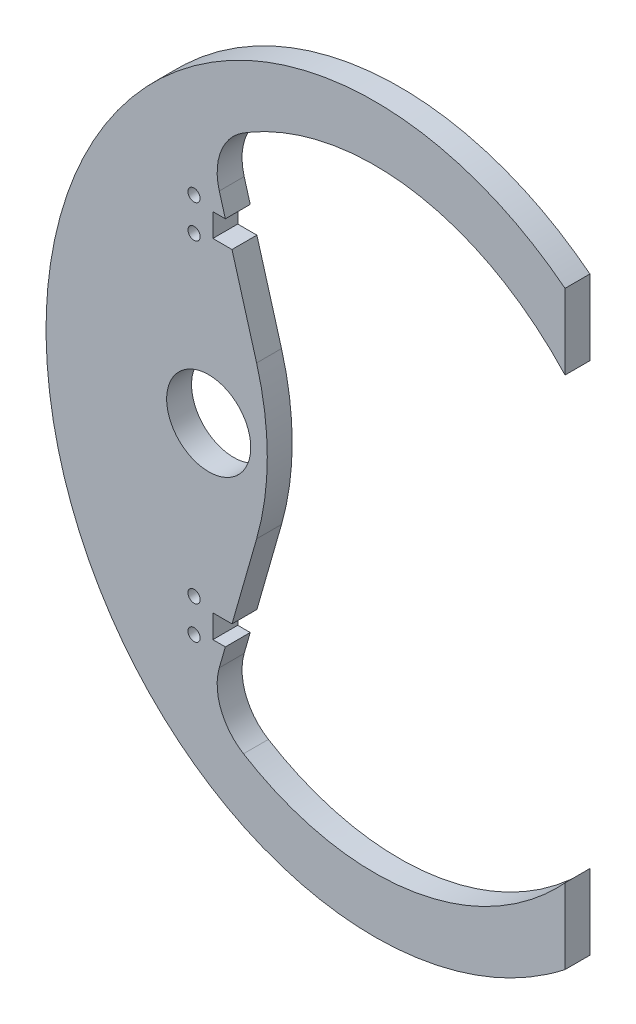
ISO-10303-21;
HEADER;
FILE_DESCRIPTION(('STEP AP214'),'2;1');
FILE_NAME('part.step','',(''),(''),'','','');
FILE_SCHEMA(('AUTOMOTIVE_DESIGN { 1 0 10303 214 1 1 1 1 }'));
ENDSEC;
DATA;
#1=APPLICATION_CONTEXT('core data for automotive mechanical design processes');
#2=APPLICATION_PROTOCOL_DEFINITION('international standard','automotive_design',2000,#1);
#3=PRODUCT_CONTEXT('',#1,'mechanical');
#4=PRODUCT('Part','Part','',(#3));
#5=PRODUCT_RELATED_PRODUCT_CATEGORY('part','',(#4));
#6=PRODUCT_DEFINITION_FORMATION('','',#4);
#7=PRODUCT_DEFINITION_CONTEXT('part definition',#1,'design');
#8=PRODUCT_DEFINITION('design','',#6,#7);
#9=PRODUCT_DEFINITION_SHAPE('','',#8);
#10=(LENGTH_UNIT() NAMED_UNIT(*) SI_UNIT(.MILLI.,.METRE.));
#11=(NAMED_UNIT(*) PLANE_ANGLE_UNIT() SI_UNIT($,.RADIAN.));
#12=(NAMED_UNIT(*) SI_UNIT($,.STERADIAN.) SOLID_ANGLE_UNIT());
#13=UNCERTAINTY_MEASURE_WITH_UNIT(LENGTH_MEASURE(1.E-05),#10,'distance_accuracy_value','');
#14=(GEOMETRIC_REPRESENTATION_CONTEXT(3) GLOBAL_UNCERTAINTY_ASSIGNED_CONTEXT((#13)) GLOBAL_UNIT_ASSIGNED_CONTEXT((#10,
#11,#12)) REPRESENTATION_CONTEXT('',''));
#15=CARTESIAN_POINT('',(0.,0.,0.));
#16=DIRECTION('',(0.,0.,1.));
#17=DIRECTION('',(1.,0.,0.));
#18=AXIS2_PLACEMENT_3D('',#15,#16,#17);
#19=CARTESIAN_POINT('',(0.,0.,2.25));
#20=DIRECTION('',(0.,0.,1.));
#21=DIRECTION('',(1.,0.,0.));
#22=AXIS2_PLACEMENT_3D('',#19,#20,#21);
#23=PLANE('',#22);
#24=CARTESIAN_POINT('',(9.40914805039206,0.,2.25));
#25=DIRECTION('',(0.,0.,1.));
#26=DIRECTION('',(1.,0.,0.));
#27=AXIS2_PLACEMENT_3D('',#24,#25,#26);
#28=CIRCLE('',#27,7.60000000000003);
#29=CARTESIAN_POINT('',(17.0091480503921,0.,2.25));
#30=VERTEX_POINT('',#29);
#31=EDGE_CURVE('E299',#30,#30,#28,.T.);
#32=ORIENTED_EDGE('',*,*,#31,.F.);
#33=EDGE_LOOP('',(#32));
#34=FACE_BOUND('',#33,.T.);
#35=CARTESIAN_POINT('',(6.75917229098305,34.4,2.25));
#36=DIRECTION('',(0.,0.,1.));
#37=DIRECTION('',(1.,0.,0.));
#38=AXIS2_PLACEMENT_3D('',#35,#36,#37);
#39=CIRCLE('',#38,1.1);
#40=CARTESIAN_POINT('',(7.85917229098305,34.4,2.25));
#41=VERTEX_POINT('',#40);
#42=EDGE_CURVE('E197',#41,#41,#39,.T.);
#43=ORIENTED_EDGE('',*,*,#42,.F.);
#44=EDGE_LOOP('',(#43));
#45=FACE_BOUND('',#44,.T.);
#46=CARTESIAN_POINT('',(6.75917229098305,28.4000000000001,2.25));
#47=DIRECTION('',(0.,0.,1.));
#48=DIRECTION('',(1.,0.,0.));
#49=AXIS2_PLACEMENT_3D('',#46,#47,#48);
#50=CIRCLE('',#49,1.1);
#51=CARTESIAN_POINT('',(7.85917229098305,28.4000000000001,2.25));
#52=VERTEX_POINT('',#51);
#53=EDGE_CURVE('E242',#52,#52,#50,.T.);
#54=ORIENTED_EDGE('',*,*,#53,.F.);
#55=EDGE_LOOP('',(#54));
#56=FACE_BOUND('',#55,.T.);
#57=CARTESIAN_POINT('',(6.75917229098305,-34.4,2.25));
#58=DIRECTION('',(0.,0.,-1.));
#59=DIRECTION('',(1.,0.,0.));
#60=AXIS2_PLACEMENT_3D('',#57,#58,#59);
#61=CIRCLE('',#60,1.1);
#62=CARTESIAN_POINT('',(7.85917229098305,-34.4,2.25));
#63=VERTEX_POINT('',#62);
#64=EDGE_CURVE('E208',#63,#63,#61,.T.);
#65=ORIENTED_EDGE('',*,*,#64,.T.);
#66=EDGE_LOOP('',(#65));
#67=FACE_BOUND('',#66,.T.);
#68=CARTESIAN_POINT('',(6.75917229098305,-28.4000000000001,2.25));
#69=DIRECTION('',(0.,0.,-1.));
#70=DIRECTION('',(1.,0.,0.));
#71=AXIS2_PLACEMENT_3D('',#68,#69,#70);
#72=CIRCLE('',#71,1.1);
#73=CARTESIAN_POINT('',(7.85917229098305,-28.4000000000001,2.25));
#74=VERTEX_POINT('',#73);
#75=EDGE_CURVE('E202',#74,#74,#72,.T.);
#76=ORIENTED_EDGE('',*,*,#75,.T.);
#77=EDGE_LOOP('',(#76));
#78=FACE_BOUND('',#77,.T.);
#79=DIRECTION('',(1.,0.,0.));
#80=VECTOR('',#79,1.);
#81=CARTESIAN_POINT('',(0.,-33.5,2.25));
#82=LINE('',#81,#80);
#83=CARTESIAN_POINT('',(10.159172290983,-33.5,2.25));
#84=VERTEX_POINT('',#83);
#85=CARTESIAN_POINT('',(12.4151049743728,-33.5,2.25));
#86=VERTEX_POINT('',#85);
#87=EDGE_CURVE('E184',#84,#86,#82,.T.);
#88=ORIENTED_EDGE('',*,*,#87,.F.);
#89=DIRECTION('',(0.,1.,0.));
#90=VECTOR('',#89,1.);
#91=CARTESIAN_POINT('',(10.159172290983,0.,2.25));
#92=LINE('',#91,#90);
#93=CARTESIAN_POINT('',(10.159172290983,-29.3,2.25));
#94=VERTEX_POINT('',#93);
#95=EDGE_CURVE('E187',#84,#94,#92,.T.);
#96=ORIENTED_EDGE('',*,*,#95,.T.);
#97=DIRECTION('',(-1.,0.,0.));
#98=VECTOR('',#97,1.);
#99=CARTESIAN_POINT('',(1.33673194385019E-13,-29.3000000000001,2.25));
#100=LINE('',#99,#98);
#101=CARTESIAN_POINT('',(13.6179402256946,-29.3,2.25));
#102=VERTEX_POINT('',#101);
#103=EDGE_CURVE('E176',#102,#94,#100,.T.);
#104=ORIENTED_EDGE('',*,*,#103,.F.);
#105=DIRECTION('',(0.275321065869488,0.961352334312706,0.));
#106=VECTOR('',#105,1.);
#107=CARTESIAN_POINT('',(20.3408174478652,-5.82539339690342,2.25));
#108=LINE('',#107,#106);
#109=CARTESIAN_POINT('',(18.0666970568287,-13.7660532934746,2.25));
#110=VERTEX_POINT('',#109);
#111=EDGE_CURVE('E293',#102,#110,#108,.T.);
#112=ORIENTED_EDGE('',*,*,#111,.T.);
#113=CARTESIAN_POINT('',(-30.0009196588065,0.,2.25));
#114=DIRECTION('',(0.,0.,1.));
#115=DIRECTION('',(1.,0.,0.));
#116=AXIS2_PLACEMENT_3D('',#113,#114,#115);
#117=CIRCLE('',#116,50.);
#118=CARTESIAN_POINT('',(18.0666970568287,13.7660532934746,2.25));
#119=VERTEX_POINT('',#118);
#120=EDGE_CURVE('E292',#110,#119,#117,.T.);
#121=ORIENTED_EDGE('',*,*,#120,.T.);
#122=DIRECTION('',(0.275321065869487,-0.961352334312706,0.));
#123=VECTOR('',#122,1.);
#124=CARTESIAN_POINT('',(20.3408174478652,5.82539339690341,2.25));
#125=LINE('',#124,#123);
#126=CARTESIAN_POINT('',(13.6179402256946,29.3,2.25));
#127=VERTEX_POINT('',#126);
#128=EDGE_CURVE('E296',#127,#119,#125,.T.);
#129=ORIENTED_EDGE('',*,*,#128,.F.);
#130=DIRECTION('',(-1.,0.,0.));
#131=VECTOR('',#130,1.);
#132=CARTESIAN_POINT('',(1.33673194385019E-13,29.3000000000001,2.25));
#133=LINE('',#132,#131);
#134=CARTESIAN_POINT('',(10.159172290983,29.3,2.25));
#135=VERTEX_POINT('',#134);
#136=EDGE_CURVE('E215',#127,#135,#133,.T.);
#137=ORIENTED_EDGE('',*,*,#136,.T.);
#138=DIRECTION('',(0.,-1.,0.));
#139=VECTOR('',#138,1.);
#140=CARTESIAN_POINT('',(10.159172290983,0.,2.25));
#141=LINE('',#140,#139);
#142=CARTESIAN_POINT('',(10.159172290983,33.5,2.25));
#143=VERTEX_POINT('',#142);
#144=EDGE_CURVE('E224',#143,#135,#141,.T.);
#145=ORIENTED_EDGE('',*,*,#144,.F.);
#146=DIRECTION('',(1.,0.,0.));
#147=VECTOR('',#146,1.);
#148=CARTESIAN_POINT('',(0.,33.5,2.25));
#149=LINE('',#148,#147);
#150=CARTESIAN_POINT('',(12.4151049743728,33.5,2.25));
#151=VERTEX_POINT('',#150);
#152=EDGE_CURVE('E221',#143,#151,#149,.T.);
#153=ORIENTED_EDGE('',*,*,#152,.T.);
#154=CARTESIAN_POINT('',(11.3229036437909,37.3136940062263,2.25));
#155=VERTEX_POINT('',#154);
#156=EDGE_CURVE('E297',#155,#151,#125,.T.);
#157=ORIENTED_EDGE('',*,*,#156,.F.);
#158=CARTESIAN_POINT('',(20.936426986918,40.0669046649212,2.25));
#159=DIRECTION('',(0.,0.,1.));
#160=DIRECTION('',(1.,0.,0.));
#161=AXIS2_PLACEMENT_3D('',#158,#159,#160);
#162=CIRCLE('',#161,10.);
#163=CARTESIAN_POINT('',(15.6973071124925,48.5846287119539,2.25));
#164=VERTEX_POINT('',#163);
#165=EDGE_CURVE('E11',#155,#164,#162,.F.);
#166=ORIENTED_EDGE('',*,*,#165,.T.);
#167=CARTESIAN_POINT('',(39.4091480503921,55.4,2.25));
#168=CARTESIAN_POINT('',(33.0800776421087,55.4,2.25));
#169=CARTESIAN_POINT('',(20.421936825542,52.6476740231345,2.25));
#170=CARTESIAN_POINT('',(3.96207034867457,40.613904368607,2.25));
#171=CARTESIAN_POINT('',(-7.31358247706304,22.1290041541449,2.25));
#172=CARTESIAN_POINT('',(-11.3294866858804,0.,2.25));
#173=CARTESIAN_POINT('',(-7.56375231723027,-20.7504828686652,2.25));
#174=CARTESIAN_POINT('',(-0.275943175553196,-33.6968178999176,2.25));
#175=CARTESIAN_POINT('',(6.7901831868975,-41.8633460695799,2.25));
#176=CARTESIAN_POINT('',(12.8993543147854,-47.0970528971454,2.25));
#177=CARTESIAN_POINT('',(23.9859356229057,-53.4226129824692,2.25));
#178=CARTESIAN_POINT('',(39.409148050392,-56.7761629884328,2.25));
#179=CARTESIAN_POINT('',(58.3963592752421,-52.6476740231345,2.25));
#180=CARTESIAN_POINT('',(74.8562257521095,-40.613904368607,2.25));
#181=CARTESIAN_POINT('',(85.192240842369,-23.6694125053501,2.25));
#182=CARTESIAN_POINT('',(88.8913504869381,-7.41661167489416,2.25));
#183=CARTESIAN_POINT('',(88.8913504869381,7.41661167489412,2.25));
#184=CARTESIAN_POINT('',(85.192240842369,23.66941250535,2.25));
#185=CARTESIAN_POINT('',(74.8562257521095,40.613904368607,2.25));
#186=CARTESIAN_POINT('',(58.3963592752422,52.6476740231345,2.25));
#187=CARTESIAN_POINT('',(45.7382184586754,55.4,2.25));
#188=CARTESIAN_POINT('',(39.4091480503921,55.4,2.25));
#189=B_SPLINE_CURVE_WITH_KNOTS('',3,(#167,#168,#169,#170,#171,#172,#173,#174,#175,#176,#177,
#178,#179,#180,#181,#182,#183,#184,#185,#186,#187,#188),.UNSPECIFIED.,.T.,.F.,(4,1,1,1,1,1,1,1,
1,1,1,1,1,1,1,1,1,1,1,4),(0.,0.392699081698724,0.785398163397448,1.17809724509617,
1.5707963267949,1.96349540849362,2.28280519000434,2.38097996042902,2.57732950127839,
2.74889357189107,3.14159265358979,3.53429173528852,3.92699081698724,4.31968989868597,
4.61421420996001,4.81056375080937,5.10508806208341,5.49778714378214,5.89048622548086,
6.28318530717959),.UNSPECIFIED.);
#190=CARTESIAN_POINT('',(73.8091480503921,39.7390724788906,2.25));
#191=VERTEX_POINT('',#190);
#192=EDGE_CURVE('E250',#191,#164,#189,.T.);
#193=ORIENTED_EDGE('',*,*,#192,.F.);
#194=DIRECTION('',(0.,1.,0.));
#195=VECTOR('',#194,1.);
#196=CARTESIAN_POINT('',(73.8091480503921,0.,2.25));
#197=LINE('',#196,#195);
#198=CARTESIAN_POINT('',(73.8091480503921,53.3158329309103,2.25));
#199=VERTEX_POINT('',#198);
#200=EDGE_CURVE('E256',#191,#199,#197,.T.);
#201=ORIENTED_EDGE('',*,*,#200,.T.);
#202=CARTESIAN_POINT('',(39.4091480503921,65.4,2.25));
#203=CARTESIAN_POINT('',(31.6424792081308,65.4,2.25));
#204=CARTESIAN_POINT('',(16.1091415236084,62.002230156418,2.25));
#205=CARTESIAN_POINT('',(-3.66421358539732,47.4725158501259,2.25));
#206=CARTESIAN_POINT('',(-16.8920558425985,25.7003697345645,2.25));
#207=CARTESIAN_POINT('',(-21.5402500031127,0.,2.25));
#208=CARTESIAN_POINT('',(-16.8920558425986,-25.7003697345645,2.25));
#209=CARTESIAN_POINT('',(-3.66421358539732,-47.4725158501259,2.25));
#210=CARTESIAN_POINT('',(16.1091415236084,-62.002230156418,2.25));
#211=CARTESIAN_POINT('',(39.409148050392,-67.098884921791,2.25));
#212=CARTESIAN_POINT('',(57.4588787231683,-63.1506780514901,2.25));
#213=CARTESIAN_POINT('',(70.2086659306455,-56.2596500062501,2.25));
#214=CARTESIAN_POINT('',(77.0482297427353,-50.9112922323206,2.25));
#215=CARTESIAN_POINT('',(86.4606584513007,-40.9639279985186,2.25));
#216=CARTESIAN_POINT('',(95.8250058599246,-25.0664357927177,2.25));
#217=CARTESIAN_POINT('',(100.358546103897,0.,2.25));
#218=CARTESIAN_POINT('',(95.7103519433826,25.7003697345645,2.25));
#219=CARTESIAN_POINT('',(85.6461631499315,42.2653532507783,2.25));
#220=CARTESIAN_POINT('',(76.5311434252749,51.2290204601219,2.25));
#221=CARTESIAN_POINT('',(70.1839447936715,56.193647407558,2.25));
#222=CARTESIAN_POINT('',(58.2860308840289,62.969746385334,2.25));
#223=CARTESIAN_POINT('',(47.1758168926533,65.4,2.25));
#224=CARTESIAN_POINT('',(39.4091480503921,65.4,2.25));
#225=B_SPLINE_CURVE_WITH_KNOTS('',3,(#202,#203,#204,#205,#206,#207,#208,#209,#210,#211,#212,
#213,#214,#215,#216,#217,#218,#219,#220,#221,#222,#223,#224),.UNSPECIFIED.,.T.,.F.,(4,1,1,1,1,1,
1,1,1,1,1,1,1,1,1,1,1,1,1,1,4),(0.,0.392699081698724,0.785398163397448,1.17809724509617,
1.5707963267949,1.96349540849362,2.35619449019234,2.74889357189107,3.14159265358979,
3.53429173528852,3.66152584758944,3.85787538843881,3.95605015886349,4.31968989868597,
4.71238898038469,5.10508806208341,5.49778714378214,5.60872512207385,5.72142956343666,
5.89048622548086,6.28318530717959),.UNSPECIFIED.);
#226=CARTESIAN_POINT('',(73.8091480503921,-53.3158329309103,2.25));
#227=VERTEX_POINT('',#226);
#228=EDGE_CURVE('E281',#199,#227,#225,.T.);
#229=ORIENTED_EDGE('',*,*,#228,.T.);
#230=CARTESIAN_POINT('',(73.8091480503921,-39.7390724788907,2.25));
#231=VERTEX_POINT('',#230);
#232=EDGE_CURVE('E286',#227,#231,#197,.T.);
#233=ORIENTED_EDGE('',*,*,#232,.T.);
#234=CARTESIAN_POINT('',(15.6979714856697,-48.5896305036835,2.25));
#235=VERTEX_POINT('',#234);
#236=EDGE_CURVE('E258',#235,#231,#189,.T.);
#237=ORIENTED_EDGE('',*,*,#236,.F.);
#238=CARTESIAN_POINT('',(20.9353085091094,-40.0708101098198,2.25));
#239=DIRECTION('',(0.,0.,1.));
#240=DIRECTION('',(1.,0.,0.));
#241=AXIS2_PLACEMENT_3D('',#238,#239,#240);
#242=CIRCLE('',#241,10.);
#243=CARTESIAN_POINT('',(11.3217851659823,-37.317599451125,2.25));
#244=VERTEX_POINT('',#243);
#245=EDGE_CURVE('E357',#235,#244,#242,.F.);
#246=ORIENTED_EDGE('',*,*,#245,.T.);
#247=EDGE_CURVE('E287',#244,#86,#108,.T.);
#248=ORIENTED_EDGE('',*,*,#247,.T.);
#249=EDGE_LOOP('',(#88,#96,#104,#112,#121,#129,#137,#145,#153,#157,#166,#193,#201,#229,#233,
#237,#246,#248));
#250=FACE_BOUND('',#249,.T.);
#251=ADVANCED_FACE('F37',(#34,#45,#56,#67,#78,#250),#23,.T.);
#252=CARTESIAN_POINT('',(0.,0.,-2.25));
#253=DIRECTION('',(0.,0.,1.));
#254=DIRECTION('',(1.,0.,0.));
#255=AXIS2_PLACEMENT_3D('',#252,#253,#254);
#256=PLANE('',#255);
#257=CARTESIAN_POINT('',(6.75917229098305,-28.4000000000001,-2.25));
#258=DIRECTION('',(0.,0.,-1.));
#259=DIRECTION('',(1.,0.,0.));
#260=AXIS2_PLACEMENT_3D('',#257,#258,#259);
#261=CIRCLE('',#260,1.1);
#262=CARTESIAN_POINT('',(7.85917229098305,-28.4000000000001,-2.25));
#263=VERTEX_POINT('',#262);
#264=EDGE_CURVE('E192',#263,#263,#261,.T.);
#265=ORIENTED_EDGE('',*,*,#264,.F.);
#266=EDGE_LOOP('',(#265));
#267=FACE_BOUND('',#266,.T.);
#268=CARTESIAN_POINT('',(6.75917229098305,-34.4,-2.25));
#269=DIRECTION('',(0.,0.,-1.));
#270=DIRECTION('',(1.,0.,0.));
#271=AXIS2_PLACEMENT_3D('',#268,#269,#270);
#272=CIRCLE('',#271,1.1);
#273=CARTESIAN_POINT('',(7.85917229098305,-34.4,-2.25));
#274=VERTEX_POINT('',#273);
#275=EDGE_CURVE('E205',#274,#274,#272,.T.);
#276=ORIENTED_EDGE('',*,*,#275,.F.);
#277=EDGE_LOOP('',(#276));
#278=FACE_BOUND('',#277,.T.);
#279=CARTESIAN_POINT('',(9.40914805039206,0.,-2.25));
#280=DIRECTION('',(0.,0.,1.));
#281=DIRECTION('',(1.,0.,0.));
#282=AXIS2_PLACEMENT_3D('',#279,#280,#281);
#283=CIRCLE('',#282,7.60000000000003);
#284=CARTESIAN_POINT('',(17.0091480503921,0.,-2.25));
#285=VERTEX_POINT('',#284);
#286=EDGE_CURVE('E257',#285,#285,#283,.T.);
#287=ORIENTED_EDGE('',*,*,#286,.T.);
#288=EDGE_LOOP('',(#287));
#289=FACE_BOUND('',#288,.T.);
#290=CARTESIAN_POINT('',(6.75917229098305,34.4,-2.25));
#291=DIRECTION('',(0.,0.,1.));
#292=DIRECTION('',(1.,0.,0.));
#293=AXIS2_PLACEMENT_3D('',#290,#291,#292);
#294=CIRCLE('',#293,1.1);
#295=CARTESIAN_POINT('',(7.85917229098305,34.4,-2.25));
#296=VERTEX_POINT('',#295);
#297=EDGE_CURVE('E245',#296,#296,#294,.T.);
#298=ORIENTED_EDGE('',*,*,#297,.T.);
#299=EDGE_LOOP('',(#298));
#300=FACE_BOUND('',#299,.T.);
#301=CARTESIAN_POINT('',(6.75917229098305,28.4000000000001,-2.25));
#302=DIRECTION('',(0.,0.,1.));
#303=DIRECTION('',(1.,0.,0.));
#304=AXIS2_PLACEMENT_3D('',#301,#302,#303);
#305=CIRCLE('',#304,1.1);
#306=CARTESIAN_POINT('',(7.85917229098305,28.4000000000001,-2.25));
#307=VERTEX_POINT('',#306);
#308=EDGE_CURVE('E225',#307,#307,#305,.T.);
#309=ORIENTED_EDGE('',*,*,#308,.T.);
#310=EDGE_LOOP('',(#309));
#311=FACE_BOUND('',#310,.T.);
#312=DIRECTION('',(0.,1.,0.));
#313=VECTOR('',#312,1.);
#314=CARTESIAN_POINT('',(10.159172290983,0.,-2.25));
#315=LINE('',#314,#313);
#316=CARTESIAN_POINT('',(10.159172290983,-33.5,-2.25));
#317=VERTEX_POINT('',#316);
#318=CARTESIAN_POINT('',(10.159172290983,-29.3,-2.25));
#319=VERTEX_POINT('',#318);
#320=EDGE_CURVE('E159',#317,#319,#315,.T.);
#321=ORIENTED_EDGE('',*,*,#320,.F.);
#322=DIRECTION('',(1.,0.,0.));
#323=VECTOR('',#322,1.);
#324=CARTESIAN_POINT('',(0.,-33.5,-2.25));
#325=LINE('',#324,#323);
#326=CARTESIAN_POINT('',(12.4151049743728,-33.5,-2.25));
#327=VERTEX_POINT('',#326);
#328=EDGE_CURVE('E169',#317,#327,#325,.T.);
#329=ORIENTED_EDGE('',*,*,#328,.T.);
#330=DIRECTION('',(0.275321065869488,0.961352334312706,0.));
#331=VECTOR('',#330,1.);
#332=CARTESIAN_POINT('',(20.3408174478652,-5.82539339690342,-2.25));
#333=LINE('',#332,#331);
#334=CARTESIAN_POINT('',(11.3217851659823,-37.317599451125,-2.25));
#335=VERTEX_POINT('',#334);
#336=EDGE_CURVE('E317',#335,#327,#333,.T.);
#337=ORIENTED_EDGE('',*,*,#336,.F.);
#338=CARTESIAN_POINT('',(20.9353085091094,-40.0708101098198,-2.25));
#339=DIRECTION('',(0.,0.,1.));
#340=DIRECTION('',(1.,0.,0.));
#341=AXIS2_PLACEMENT_3D('',#338,#339,#340);
#342=CIRCLE('',#341,10.);
#343=CARTESIAN_POINT('',(15.6979714856697,-48.5896305036835,-2.25));
#344=VERTEX_POINT('',#343);
#345=EDGE_CURVE('E355',#335,#344,#342,.T.);
#346=ORIENTED_EDGE('',*,*,#345,.T.);
#347=CARTESIAN_POINT('',(39.4091480503921,55.4,-2.25));
#348=CARTESIAN_POINT('',(33.0800776421087,55.4,-2.25));
#349=CARTESIAN_POINT('',(20.421936825542,52.6476740231345,-2.25));
#350=CARTESIAN_POINT('',(3.96207034867457,40.613904368607,-2.25));
#351=CARTESIAN_POINT('',(-7.31358247706304,22.1290041541449,-2.25));
#352=CARTESIAN_POINT('',(-11.3294866858804,0.,-2.25));
#353=CARTESIAN_POINT('',(-7.56375231723027,-20.7504828686652,-2.25));
#354=CARTESIAN_POINT('',(-0.275943175553196,-33.6968178999176,-2.25));
#355=CARTESIAN_POINT('',(6.7901831868975,-41.8633460695799,-2.25));
#356=CARTESIAN_POINT('',(12.8993543147854,-47.0970528971454,-2.25));
#357=CARTESIAN_POINT('',(23.9859356229057,-53.4226129824692,-2.25));
#358=CARTESIAN_POINT('',(39.409148050392,-56.7761629884328,-2.25));
#359=CARTESIAN_POINT('',(58.3963592752421,-52.6476740231345,-2.25));
#360=CARTESIAN_POINT('',(74.8562257521095,-40.613904368607,-2.25));
#361=CARTESIAN_POINT('',(85.192240842369,-23.6694125053501,-2.25));
#362=CARTESIAN_POINT('',(88.8913504869381,-7.41661167489416,-2.25));
#363=CARTESIAN_POINT('',(88.8913504869381,7.41661167489412,-2.25));
#364=CARTESIAN_POINT('',(85.192240842369,23.66941250535,-2.25));
#365=CARTESIAN_POINT('',(74.8562257521095,40.613904368607,-2.25));
#366=CARTESIAN_POINT('',(58.3963592752422,52.6476740231345,-2.25));
#367=CARTESIAN_POINT('',(45.7382184586754,55.4,-2.25));
#368=CARTESIAN_POINT('',(39.4091480503921,55.4,-2.25));
#369=B_SPLINE_CURVE_WITH_KNOTS('',3,(#347,#348,#349,#350,#351,#352,#353,#354,#355,#356,#357,
#358,#359,#360,#361,#362,#363,#364,#365,#366,#367,#368),.UNSPECIFIED.,.T.,.F.,(4,1,1,1,1,1,1,1,
1,1,1,1,1,1,1,1,1,1,1,4),(0.,0.392699081698724,0.785398163397448,1.17809724509617,
1.5707963267949,1.96349540849362,2.28280519000434,2.38097996042902,2.57732950127839,
2.74889357189107,3.14159265358979,3.53429173528852,3.92699081698724,4.31968989868597,
4.61421420996001,4.81056375080937,5.10508806208341,5.49778714378214,5.89048622548086,
6.28318530717959),.UNSPECIFIED.);
#370=CARTESIAN_POINT('',(73.8091480503921,-39.7390724788907,-2.25));
#371=VERTEX_POINT('',#370);
#372=EDGE_CURVE('E307',#344,#371,#369,.T.);
#373=ORIENTED_EDGE('',*,*,#372,.T.);
#374=DIRECTION('',(0.,1.,0.));
#375=VECTOR('',#374,1.);
#376=CARTESIAN_POINT('',(73.8091480503921,0.,-2.25));
#377=LINE('',#376,#375);
#378=CARTESIAN_POINT('',(73.8091480503921,-53.3158329309103,-2.25));
#379=VERTEX_POINT('',#378);
#380=EDGE_CURVE('E313',#379,#371,#377,.T.);
#381=ORIENTED_EDGE('',*,*,#380,.F.);
#382=CARTESIAN_POINT('',(39.4091480503921,65.4,-2.25));
#383=CARTESIAN_POINT('',(31.6424792081308,65.4,-2.25));
#384=CARTESIAN_POINT('',(16.1091415236084,62.002230156418,-2.25));
#385=CARTESIAN_POINT('',(-3.66421358539732,47.4725158501259,-2.25));
#386=CARTESIAN_POINT('',(-16.8920558425985,25.7003697345645,-2.25));
#387=CARTESIAN_POINT('',(-21.5402500031127,0.,-2.25));
#388=CARTESIAN_POINT('',(-16.8920558425986,-25.7003697345645,-2.25));
#389=CARTESIAN_POINT('',(-3.66421358539732,-47.4725158501259,-2.25));
#390=CARTESIAN_POINT('',(16.1091415236084,-62.002230156418,-2.25));
#391=CARTESIAN_POINT('',(39.409148050392,-67.098884921791,-2.25));
#392=CARTESIAN_POINT('',(57.4588787231683,-63.1506780514901,-2.25));
#393=CARTESIAN_POINT('',(70.2086659306455,-56.2596500062501,-2.25));
#394=CARTESIAN_POINT('',(77.0482297427353,-50.9112922323206,-2.25));
#395=CARTESIAN_POINT('',(86.4606584513007,-40.9639279985186,-2.25));
#396=CARTESIAN_POINT('',(95.8250058599246,-25.0664357927177,-2.25));
#397=CARTESIAN_POINT('',(100.358546103897,0.,-2.25));
#398=CARTESIAN_POINT('',(95.7103519433826,25.7003697345645,-2.25));
#399=CARTESIAN_POINT('',(85.6461631499315,42.2653532507783,-2.25));
#400=CARTESIAN_POINT('',(76.5311434252749,51.2290204601219,-2.25));
#401=CARTESIAN_POINT('',(70.1839447936715,56.193647407558,-2.25));
#402=CARTESIAN_POINT('',(58.2860308840289,62.969746385334,-2.25));
#403=CARTESIAN_POINT('',(47.1758168926533,65.4,-2.25));
#404=CARTESIAN_POINT('',(39.4091480503921,65.4,-2.25));
#405=B_SPLINE_CURVE_WITH_KNOTS('',3,(#382,#383,#384,#385,#386,#387,#388,#389,#390,#391,#392,
#393,#394,#395,#396,#397,#398,#399,#400,#401,#402,#403,#404),.UNSPECIFIED.,.T.,.F.,(4,1,1,1,1,1,
1,1,1,1,1,1,1,1,1,1,1,1,1,1,4),(0.,0.392699081698724,0.785398163397448,1.17809724509617,
1.5707963267949,1.96349540849362,2.35619449019234,2.74889357189107,3.14159265358979,
3.53429173528852,3.66152584758944,3.85787538843881,3.95605015886349,4.31968989868597,
4.71238898038469,5.10508806208341,5.49778714378214,5.60872512207385,5.72142956343666,
5.89048622548086,6.28318530717959),.UNSPECIFIED.);
#406=CARTESIAN_POINT('',(73.8091480503921,53.3158329309103,-2.25));
#407=VERTEX_POINT('',#406);
#408=EDGE_CURVE('E312',#407,#379,#405,.T.);
#409=ORIENTED_EDGE('',*,*,#408,.F.);
#410=CARTESIAN_POINT('',(73.8091480503921,39.7390724788906,-2.25));
#411=VERTEX_POINT('',#410);
#412=EDGE_CURVE('E306',#411,#407,#377,.T.);
#413=ORIENTED_EDGE('',*,*,#412,.F.);
#414=CARTESIAN_POINT('',(15.6973071124925,48.5846287119539,-2.25));
#415=VERTEX_POINT('',#414);
#416=EDGE_CURVE('E233',#411,#415,#369,.T.);
#417=ORIENTED_EDGE('',*,*,#416,.T.);
#418=CARTESIAN_POINT('',(20.936426986918,40.0669046649212,-2.25));
#419=DIRECTION('',(0.,0.,1.));
#420=DIRECTION('',(1.,0.,0.));
#421=AXIS2_PLACEMENT_3D('',#418,#419,#420);
#422=CIRCLE('',#421,10.);
#423=CARTESIAN_POINT('',(11.3229036437909,37.3136940062263,-2.25));
#424=VERTEX_POINT('',#423);
#425=EDGE_CURVE('E45',#415,#424,#422,.T.);
#426=ORIENTED_EDGE('',*,*,#425,.T.);
#427=DIRECTION('',(0.275321065869487,-0.961352334312706,0.));
#428=VECTOR('',#427,1.);
#429=CARTESIAN_POINT('',(20.3408174478652,5.82539339690341,-2.25));
#430=LINE('',#429,#428);
#431=CARTESIAN_POINT('',(12.4151049743728,33.5,-2.25));
#432=VERTEX_POINT('',#431);
#433=EDGE_CURVE('E326',#424,#432,#430,.T.);
#434=ORIENTED_EDGE('',*,*,#433,.T.);
#435=DIRECTION('',(1.,0.,0.));
#436=VECTOR('',#435,1.);
#437=CARTESIAN_POINT('',(0.,33.5,-2.25));
#438=LINE('',#437,#436);
#439=CARTESIAN_POINT('',(10.159172290983,33.5,-2.25));
#440=VERTEX_POINT('',#439);
#441=EDGE_CURVE('E211',#440,#432,#438,.T.);
#442=ORIENTED_EDGE('',*,*,#441,.F.);
#443=DIRECTION('',(0.,-1.,0.));
#444=VECTOR('',#443,1.);
#445=CARTESIAN_POINT('',(10.159172290983,0.,-2.25));
#446=LINE('',#445,#444);
#447=CARTESIAN_POINT('',(10.159172290983,29.3,-2.25));
#448=VERTEX_POINT('',#447);
#449=EDGE_CURVE('E214',#440,#448,#446,.T.);
#450=ORIENTED_EDGE('',*,*,#449,.T.);
#451=DIRECTION('',(-1.,0.,0.));
#452=VECTOR('',#451,1.);
#453=CARTESIAN_POINT('',(1.33673194385019E-13,29.3000000000001,-2.25));
#454=LINE('',#453,#452);
#455=CARTESIAN_POINT('',(13.6179402256946,29.3,-2.25));
#456=VERTEX_POINT('',#455);
#457=EDGE_CURVE('E218',#456,#448,#454,.T.);
#458=ORIENTED_EDGE('',*,*,#457,.F.);
#459=CARTESIAN_POINT('',(18.0666970568287,13.7660532934746,-2.25));
#460=VERTEX_POINT('',#459);
#461=EDGE_CURVE('E325',#456,#460,#430,.T.);
#462=ORIENTED_EDGE('',*,*,#461,.T.);
#463=CARTESIAN_POINT('',(-30.0009196588065,0.,-2.25));
#464=DIRECTION('',(0.,0.,1.));
#465=DIRECTION('',(1.,0.,0.));
#466=AXIS2_PLACEMENT_3D('',#463,#464,#465);
#467=CIRCLE('',#466,50.);
#468=CARTESIAN_POINT('',(18.0666970568287,-13.7660532934746,-2.25));
#469=VERTEX_POINT('',#468);
#470=EDGE_CURVE('E322',#469,#460,#467,.T.);
#471=ORIENTED_EDGE('',*,*,#470,.F.);
#472=CARTESIAN_POINT('',(13.6179402256946,-29.3,-2.25));
#473=VERTEX_POINT('',#472);
#474=EDGE_CURVE('E183',#473,#469,#333,.T.);
#475=ORIENTED_EDGE('',*,*,#474,.F.);
#476=DIRECTION('',(-1.,0.,0.));
#477=VECTOR('',#476,1.);
#478=CARTESIAN_POINT('',(1.33673194385019E-13,-29.3000000000001,-2.25));
#479=LINE('',#478,#477);
#480=EDGE_CURVE('E170',#473,#319,#479,.T.);
#481=ORIENTED_EDGE('',*,*,#480,.T.);
#482=EDGE_LOOP('',(#321,#329,#337,#346,#373,#381,#409,#413,#417,#426,#434,#442,#450,#458,#462,
#471,#475,#481));
#483=FACE_BOUND('',#482,.T.);
#484=ADVANCED_FACE('F181',(#267,#278,#289,#300,#311,#483),#256,.F.);
#485=CARTESIAN_POINT('',(20.3408174478652,-5.82539339690342,2.25));
#486=DIRECTION('',(-0.961352334312706,0.275321065869488,0.));
#487=DIRECTION('',(-0.275321065869488,-0.961352334312706,0.));
#488=AXIS2_PLACEMENT_3D('',#485,#486,#487);
#489=PLANE('',#488);
#490=ORIENTED_EDGE('',*,*,#247,.F.);
#491=DIRECTION('',(0.,0.,-1.));
#492=VECTOR('',#491,1.);
#493=CARTESIAN_POINT('',(11.3217851659823,-37.317599451125,2.25));
#494=LINE('',#493,#492);
#495=EDGE_CURVE('E346',#244,#335,#494,.T.);
#496=ORIENTED_EDGE('',*,*,#495,.T.);
#497=ORIENTED_EDGE('',*,*,#336,.T.);
#498=DIRECTION('',(0.,0.,1.));
#499=VECTOR('',#498,1.);
#500=CARTESIAN_POINT('',(12.4151049743728,-33.5,-2.25));
#501=LINE('',#500,#499);
#502=EDGE_CURVE('E194',#327,#86,#501,.T.);
#503=ORIENTED_EDGE('',*,*,#502,.T.);
#504=EDGE_LOOP('',(#490,#496,#497,#503));
#505=FACE_BOUND('',#504,.T.);
#506=ADVANCED_FACE('F368',(#505),#489,.F.);
#507=CARTESIAN_POINT('',(20.3408174478652,5.82539339690341,2.25));
#508=DIRECTION('',(0.961352334312706,0.275321065869487,0.));
#509=DIRECTION('',(-0.275321065869488,0.961352334312706,0.));
#510=AXIS2_PLACEMENT_3D('',#507,#508,#509);
#511=PLANE('',#510);
#512=ORIENTED_EDGE('',*,*,#461,.F.);
#513=DIRECTION('',(0.,0.,1.));
#514=VECTOR('',#513,1.);
#515=CARTESIAN_POINT('',(13.6179402256946,29.3,-2.25));
#516=LINE('',#515,#514);
#517=EDGE_CURVE('E230',#456,#127,#516,.T.);
#518=ORIENTED_EDGE('',*,*,#517,.T.);
#519=ORIENTED_EDGE('',*,*,#128,.T.);
#520=DIRECTION('',(0.,0.,-1.));
#521=VECTOR('',#520,1.);
#522=CARTESIAN_POINT('',(18.0666970568287,13.7660532934746,2.25));
#523=LINE('',#522,#521);
#524=EDGE_CURVE('E302',#119,#460,#523,.T.);
#525=ORIENTED_EDGE('',*,*,#524,.T.);
#526=EDGE_LOOP('',(#512,#518,#519,#525));
#527=FACE_BOUND('',#526,.T.);
#528=ADVANCED_FACE('F406',(#527),#511,.T.);
#529=ORIENTED_EDGE('',*,*,#433,.F.);
#530=DIRECTION('',(0.,0.,1.));
#531=VECTOR('',#530,1.);
#532=CARTESIAN_POINT('',(11.3229036437909,37.3136940062263,2.25));
#533=LINE('',#532,#531);
#534=EDGE_CURVE('E58',#424,#155,#533,.T.);
#535=ORIENTED_EDGE('',*,*,#534,.T.);
#536=ORIENTED_EDGE('',*,*,#156,.T.);
#537=DIRECTION('',(0.,0.,1.));
#538=VECTOR('',#537,1.);
#539=CARTESIAN_POINT('',(12.4151049743728,33.5,-2.25));
#540=LINE('',#539,#538);
#541=EDGE_CURVE('E220',#432,#151,#540,.T.);
#542=ORIENTED_EDGE('',*,*,#541,.F.);
#543=EDGE_LOOP('',(#529,#535,#536,#542));
#544=FACE_BOUND('',#543,.T.);
#545=ADVANCED_FACE('F392',(#544),#511,.T.);
#546=DIRECTION('',(0.,0.,-1.));
#547=VECTOR('',#546,1.);
#548=SURFACE_OF_LINEAR_EXTRUSION('',#189,#547);
#549=ORIENTED_EDGE('',*,*,#192,.T.);
#550=DIRECTION('',(0.,0.,-1.));
#551=VECTOR('',#550,1.);
#552=CARTESIAN_POINT('',(15.6973071124925,48.5846287119539,2.25));
#553=LINE('',#552,#551);
#554=EDGE_CURVE('E351',#164,#415,#553,.T.);
#555=ORIENTED_EDGE('',*,*,#554,.T.);
#556=ORIENTED_EDGE('',*,*,#416,.F.);
#557=DIRECTION('',(0.,0.,-1.));
#558=VECTOR('',#557,1.);
#559=CARTESIAN_POINT('',(73.8091480503921,39.7390724788906,2.25));
#560=LINE('',#559,#558);
#561=EDGE_CURVE('E344',#191,#411,#560,.T.);
#562=ORIENTED_EDGE('',*,*,#561,.F.);
#563=EDGE_LOOP('',(#549,#555,#556,#562));
#564=FACE_BOUND('',#563,.T.);
#565=ADVANCED_FACE('F271',(#564),#548,.T.);
#566=CARTESIAN_POINT('',(73.8091480503921,0.,2.25));
#567=DIRECTION('',(-1.,0.,0.));
#568=DIRECTION('',(0.,0.,1.));
#569=AXIS2_PLACEMENT_3D('',#566,#567,#568);
#570=PLANE('',#569);
#571=ORIENTED_EDGE('',*,*,#412,.T.);
#572=DIRECTION('',(0.,0.,-1.));
#573=VECTOR('',#572,1.);
#574=CARTESIAN_POINT('',(73.8091480503921,53.3158329309103,2.25));
#575=LINE('',#574,#573);
#576=EDGE_CURVE('E341',#199,#407,#575,.T.);
#577=ORIENTED_EDGE('',*,*,#576,.F.);
#578=ORIENTED_EDGE('',*,*,#200,.F.);
#579=ORIENTED_EDGE('',*,*,#561,.T.);
#580=EDGE_LOOP('',(#571,#577,#578,#579));
#581=FACE_BOUND('',#580,.T.);
#582=ADVANCED_FACE('F277',(#581),#570,.F.);
#583=DIRECTION('',(0.,0.,-1.));
#584=VECTOR('',#583,1.);
#585=SURFACE_OF_LINEAR_EXTRUSION('',#225,#584);
#586=ORIENTED_EDGE('',*,*,#408,.T.);
#587=DIRECTION('',(0.,0.,-1.));
#588=VECTOR('',#587,1.);
#589=CARTESIAN_POINT('',(73.8091480503921,-53.3158329309103,2.25));
#590=LINE('',#589,#588);
#591=EDGE_CURVE('E338',#227,#379,#590,.T.);
#592=ORIENTED_EDGE('',*,*,#591,.F.);
#593=ORIENTED_EDGE('',*,*,#228,.F.);
#594=ORIENTED_EDGE('',*,*,#576,.T.);
#595=EDGE_LOOP('',(#586,#592,#593,#594));
#596=FACE_BOUND('',#595,.T.);
#597=ADVANCED_FACE('F275',(#596),#585,.F.);
#598=ORIENTED_EDGE('',*,*,#380,.T.);
#599=DIRECTION('',(0.,0.,-1.));
#600=VECTOR('',#599,1.);
#601=CARTESIAN_POINT('',(73.8091480503921,-39.7390724788907,2.25));
#602=LINE('',#601,#600);
#603=EDGE_CURVE('E335',#231,#371,#602,.T.);
#604=ORIENTED_EDGE('',*,*,#603,.F.);
#605=ORIENTED_EDGE('',*,*,#232,.F.);
#606=ORIENTED_EDGE('',*,*,#591,.T.);
#607=EDGE_LOOP('',(#598,#604,#605,#606));
#608=FACE_BOUND('',#607,.T.);
#609=ADVANCED_FACE('F269',(#608),#570,.F.);
#610=ORIENTED_EDGE('',*,*,#372,.F.);
#611=DIRECTION('',(0.,0.,-1.));
#612=VECTOR('',#611,1.);
#613=CARTESIAN_POINT('',(15.6979714856696,-48.5896305036835,-2.25));
#614=LINE('',#613,#612);
#615=EDGE_CURVE('E349',#344,#235,#614,.F.);
#616=ORIENTED_EDGE('',*,*,#615,.T.);
#617=ORIENTED_EDGE('',*,*,#236,.T.);
#618=ORIENTED_EDGE('',*,*,#603,.T.);
#619=EDGE_LOOP('',(#610,#616,#617,#618));
#620=FACE_BOUND('',#619,.T.);
#621=ADVANCED_FACE('F264',(#620),#548,.T.);
#622=ORIENTED_EDGE('',*,*,#111,.F.);
#623=DIRECTION('',(0.,0.,1.));
#624=VECTOR('',#623,1.);
#625=CARTESIAN_POINT('',(13.6179402256946,-29.3,-2.25));
#626=LINE('',#625,#624);
#627=EDGE_CURVE('E178',#473,#102,#626,.T.);
#628=ORIENTED_EDGE('',*,*,#627,.F.);
#629=ORIENTED_EDGE('',*,*,#474,.T.);
#630=DIRECTION('',(0.,0.,-1.));
#631=VECTOR('',#630,1.);
#632=CARTESIAN_POINT('',(18.0666970568287,-13.7660532934746,2.25));
#633=LINE('',#632,#631);
#634=EDGE_CURVE('E332',#110,#469,#633,.T.);
#635=ORIENTED_EDGE('',*,*,#634,.F.);
#636=EDGE_LOOP('',(#622,#628,#629,#635));
#637=FACE_BOUND('',#636,.T.);
#638=ADVANCED_FACE('F268',(#637),#489,.F.);
#639=CARTESIAN_POINT('',(-30.0009196588065,0.,2.25));
#640=DIRECTION('',(0.,0.,-1.));
#641=DIRECTION('',(-1.,0.,0.));
#642=AXIS2_PLACEMENT_3D('',#639,#640,#641);
#643=CYLINDRICAL_SURFACE('',#642,50.);
#644=ORIENTED_EDGE('',*,*,#470,.T.);
#645=ORIENTED_EDGE('',*,*,#524,.F.);
#646=ORIENTED_EDGE('',*,*,#120,.F.);
#647=ORIENTED_EDGE('',*,*,#634,.T.);
#648=EDGE_LOOP('',(#644,#645,#646,#647));
#649=FACE_BOUND('',#648,.T.);
#650=ADVANCED_FACE('F412',(#649),#643,.T.);
#651=CARTESIAN_POINT('',(9.40914805039206,0.,2.25));
#652=DIRECTION('',(0.,0.,-1.));
#653=DIRECTION('',(-1.,0.,0.));
#654=AXIS2_PLACEMENT_3D('',#651,#652,#653);
#655=CYLINDRICAL_SURFACE('',#654,7.60000000000003);
#656=ORIENTED_EDGE('',*,*,#31,.T.);
#657=EDGE_LOOP('',(#656));
#658=FACE_BOUND('',#657,.T.);
#659=ORIENTED_EDGE('',*,*,#286,.F.);
#660=EDGE_LOOP('',(#659));
#661=FACE_BOUND('',#660,.T.);
#662=ADVANCED_FACE('F438',(#658,#661),#655,.F.);
#663=CARTESIAN_POINT('',(6.75917229098305,34.4,-2.25));
#664=DIRECTION('',(0.,0.,1.));
#665=DIRECTION('',(1.,0.,0.));
#666=AXIS2_PLACEMENT_3D('',#663,#664,#665);
#667=CYLINDRICAL_SURFACE('',#666,1.1);
#668=ORIENTED_EDGE('',*,*,#297,.F.);
#669=EDGE_LOOP('',(#668));
#670=FACE_BOUND('',#669,.T.);
#671=ORIENTED_EDGE('',*,*,#42,.T.);
#672=EDGE_LOOP('',(#671));
#673=FACE_BOUND('',#672,.T.);
#674=ADVANCED_FACE('F435',(#670,#673),#667,.F.);
#675=CARTESIAN_POINT('',(6.75917229098305,28.4000000000001,-2.25));
#676=DIRECTION('',(0.,0.,1.));
#677=DIRECTION('',(1.,0.,0.));
#678=AXIS2_PLACEMENT_3D('',#675,#676,#677);
#679=CYLINDRICAL_SURFACE('',#678,1.1);
#680=ORIENTED_EDGE('',*,*,#308,.F.);
#681=EDGE_LOOP('',(#680));
#682=FACE_BOUND('',#681,.T.);
#683=ORIENTED_EDGE('',*,*,#53,.T.);
#684=EDGE_LOOP('',(#683));
#685=FACE_BOUND('',#684,.T.);
#686=ADVANCED_FACE('F563',(#682,#685),#679,.F.);
#687=CARTESIAN_POINT('',(1.33673194385019E-13,29.3000000000001,-2.25));
#688=DIRECTION('',(0.,1.,0.));
#689=DIRECTION('',(-1.,0.,0.));
#690=AXIS2_PLACEMENT_3D('',#687,#688,#689);
#691=PLANE('',#690);
#692=ORIENTED_EDGE('',*,*,#136,.F.);
#693=ORIENTED_EDGE('',*,*,#517,.F.);
#694=ORIENTED_EDGE('',*,*,#457,.T.);
#695=DIRECTION('',(0.,0.,1.));
#696=VECTOR('',#695,1.);
#697=CARTESIAN_POINT('',(10.159172290983,29.3,-2.25));
#698=LINE('',#697,#696);
#699=EDGE_CURVE('E234',#448,#135,#698,.T.);
#700=ORIENTED_EDGE('',*,*,#699,.T.);
#701=EDGE_LOOP('',(#692,#693,#694,#700));
#702=FACE_BOUND('',#701,.T.);
#703=ADVANCED_FACE('F403',(#702),#691,.T.);
#704=CARTESIAN_POINT('',(10.159172290983,0.,-2.25));
#705=DIRECTION('',(-1.,0.,0.));
#706=DIRECTION('',(0.,0.,1.));
#707=AXIS2_PLACEMENT_3D('',#704,#705,#706);
#708=PLANE('',#707);
#709=ORIENTED_EDGE('',*,*,#144,.T.);
#710=ORIENTED_EDGE('',*,*,#699,.F.);
#711=ORIENTED_EDGE('',*,*,#449,.F.);
#712=DIRECTION('',(0.,0.,1.));
#713=VECTOR('',#712,1.);
#714=CARTESIAN_POINT('',(10.159172290983,33.5,-2.25));
#715=LINE('',#714,#713);
#716=EDGE_CURVE('E236',#440,#143,#715,.T.);
#717=ORIENTED_EDGE('',*,*,#716,.T.);
#718=EDGE_LOOP('',(#709,#710,#711,#717));
#719=FACE_BOUND('',#718,.T.);
#720=ADVANCED_FACE('F401',(#719),#708,.F.);
#721=CARTESIAN_POINT('',(0.,33.5,-2.25));
#722=DIRECTION('',(0.,-1.,0.));
#723=DIRECTION('',(0.,0.,-1.));
#724=AXIS2_PLACEMENT_3D('',#721,#722,#723);
#725=PLANE('',#724);
#726=ORIENTED_EDGE('',*,*,#152,.F.);
#727=ORIENTED_EDGE('',*,*,#716,.F.);
#728=ORIENTED_EDGE('',*,*,#441,.T.);
#729=ORIENTED_EDGE('',*,*,#541,.T.);
#730=EDGE_LOOP('',(#726,#727,#728,#729));
#731=FACE_BOUND('',#730,.T.);
#732=ADVANCED_FACE('F394',(#731),#725,.T.);
#733=CARTESIAN_POINT('',(0.,-33.5,-2.25));
#734=DIRECTION('',(0.,-1.,0.));
#735=DIRECTION('',(0.,0.,-1.));
#736=AXIS2_PLACEMENT_3D('',#733,#734,#735);
#737=PLANE('',#736);
#738=ORIENTED_EDGE('',*,*,#87,.T.);
#739=ORIENTED_EDGE('',*,*,#502,.F.);
#740=ORIENTED_EDGE('',*,*,#328,.F.);
#741=DIRECTION('',(0.,0.,1.));
#742=VECTOR('',#741,1.);
#743=CARTESIAN_POINT('',(10.159172290983,-33.5,-2.25));
#744=LINE('',#743,#742);
#745=EDGE_CURVE('E165',#317,#84,#744,.T.);
#746=ORIENTED_EDGE('',*,*,#745,.T.);
#747=EDGE_LOOP('',(#738,#739,#740,#746));
#748=FACE_BOUND('',#747,.T.);
#749=ADVANCED_FACE('F415',(#748),#737,.F.);
#750=CARTESIAN_POINT('',(10.159172290983,0.,-2.25));
#751=DIRECTION('',(1.,0.,0.));
#752=DIRECTION('',(0.,0.,-1.));
#753=AXIS2_PLACEMENT_3D('',#750,#751,#752);
#754=PLANE('',#753);
#755=ORIENTED_EDGE('',*,*,#95,.F.);
#756=ORIENTED_EDGE('',*,*,#745,.F.);
#757=ORIENTED_EDGE('',*,*,#320,.T.);
#758=DIRECTION('',(0.,0.,1.));
#759=VECTOR('',#758,1.);
#760=CARTESIAN_POINT('',(10.159172290983,-29.3,-2.25));
#761=LINE('',#760,#759);
#762=EDGE_CURVE('E163',#319,#94,#761,.T.);
#763=ORIENTED_EDGE('',*,*,#762,.T.);
#764=EDGE_LOOP('',(#755,#756,#757,#763));
#765=FACE_BOUND('',#764,.T.);
#766=ADVANCED_FACE('F162',(#765),#754,.T.);
#767=CARTESIAN_POINT('',(1.33673194385019E-13,-29.3000000000001,-2.25));
#768=DIRECTION('',(0.,1.,0.));
#769=DIRECTION('',(-1.,0.,0.));
#770=AXIS2_PLACEMENT_3D('',#767,#768,#769);
#771=PLANE('',#770);
#772=ORIENTED_EDGE('',*,*,#103,.T.);
#773=ORIENTED_EDGE('',*,*,#762,.F.);
#774=ORIENTED_EDGE('',*,*,#480,.F.);
#775=ORIENTED_EDGE('',*,*,#627,.T.);
#776=EDGE_LOOP('',(#772,#773,#774,#775));
#777=FACE_BOUND('',#776,.T.);
#778=ADVANCED_FACE('F173',(#777),#771,.F.);
#779=CARTESIAN_POINT('',(6.75917229098305,-34.4,-2.25));
#780=DIRECTION('',(0.,0.,1.));
#781=DIRECTION('',(1.,0.,0.));
#782=AXIS2_PLACEMENT_3D('',#779,#780,#781);
#783=CYLINDRICAL_SURFACE('',#782,1.1);
#784=ORIENTED_EDGE('',*,*,#275,.T.);
#785=EDGE_LOOP('',(#784));
#786=FACE_BOUND('',#785,.T.);
#787=ORIENTED_EDGE('',*,*,#64,.F.);
#788=EDGE_LOOP('',(#787));
#789=FACE_BOUND('',#788,.T.);
#790=ADVANCED_FACE('F512',(#786,#789),#783,.F.);
#791=CARTESIAN_POINT('',(6.75917229098305,-28.4000000000001,-2.25));
#792=DIRECTION('',(0.,0.,1.));
#793=DIRECTION('',(1.,0.,0.));
#794=AXIS2_PLACEMENT_3D('',#791,#792,#793);
#795=CYLINDRICAL_SURFACE('',#794,1.1);
#796=ORIENTED_EDGE('',*,*,#264,.T.);
#797=EDGE_LOOP('',(#796));
#798=FACE_BOUND('',#797,.T.);
#799=ORIENTED_EDGE('',*,*,#75,.F.);
#800=EDGE_LOOP('',(#799));
#801=FACE_BOUND('',#800,.T.);
#802=ADVANCED_FACE('F497',(#798,#801),#795,.F.);
#803=CARTESIAN_POINT('',(20.9353085091094,-40.0708101098198,0.));
#804=DIRECTION('',(0.,0.,-1.));
#805=DIRECTION('',(-1.,0.,0.));
#806=AXIS2_PLACEMENT_3D('',#803,#804,#805);
#807=CYLINDRICAL_SURFACE('',#806,10.);
#808=ORIENTED_EDGE('',*,*,#245,.F.);
#809=ORIENTED_EDGE('',*,*,#615,.F.);
#810=ORIENTED_EDGE('',*,*,#345,.F.);
#811=ORIENTED_EDGE('',*,*,#495,.F.);
#812=EDGE_LOOP('',(#808,#809,#810,#811));
#813=FACE_BOUND('',#812,.T.);
#814=ADVANCED_FACE('F280',(#813),#807,.F.);
#815=CARTESIAN_POINT('',(20.936426986918,40.0669046649212,0.));
#816=DIRECTION('',(0.,0.,-1.));
#817=DIRECTION('',(-1.,0.,0.));
#818=AXIS2_PLACEMENT_3D('',#815,#816,#817);
#819=CYLINDRICAL_SURFACE('',#818,10.);
#820=ORIENTED_EDGE('',*,*,#165,.F.);
#821=ORIENTED_EDGE('',*,*,#534,.F.);
#822=ORIENTED_EDGE('',*,*,#425,.F.);
#823=ORIENTED_EDGE('',*,*,#554,.F.);
#824=EDGE_LOOP('',(#820,#821,#822,#823));
#825=FACE_BOUND('',#824,.T.);
#826=ADVANCED_FACE('F39',(#825),#819,.F.);
#827=CLOSED_SHELL('',(#251,#484,#506,#528,#545,#565,#582,#597,#609,#621,#638,#650,#662,#674,
#686,#703,#720,#732,#749,#766,#778,#790,#802,#814,#826));
#828=MANIFOLD_SOLID_BREP('B2',#827);
#829=ADVANCED_BREP_SHAPE_REPRESENTATION('',(#18,#828),#14);
#830=SHAPE_DEFINITION_REPRESENTATION(#9,#829);
ENDSEC;
END-ISO-10303-21;
